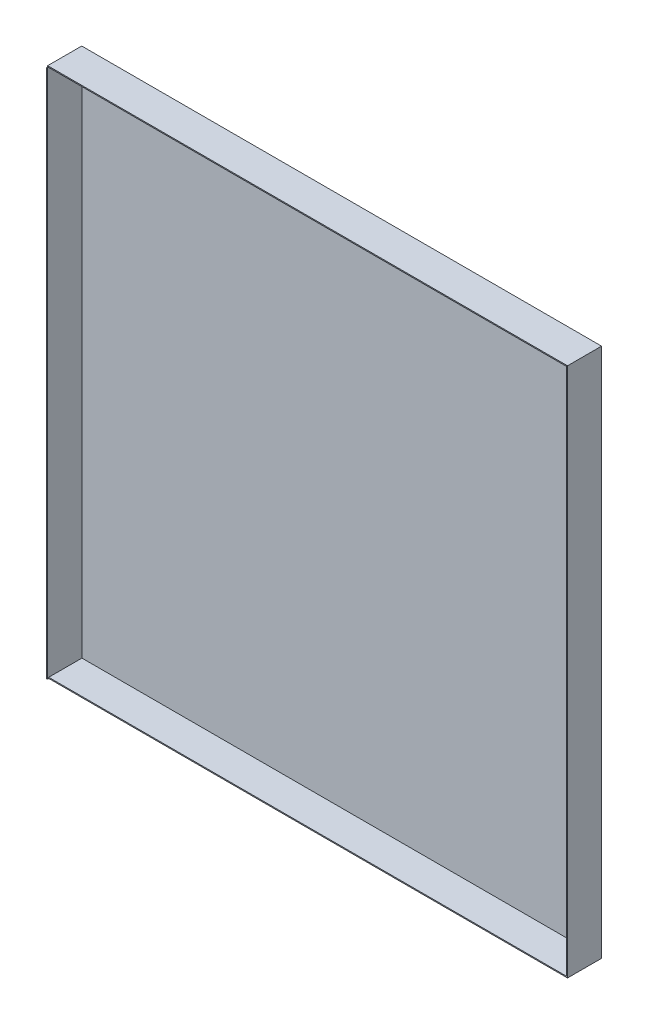
ISO-10303-21;
HEADER;
FILE_DESCRIPTION(('STEP AP214'),'2;1');
FILE_NAME('part.step','',(''),(''),'','','');
FILE_SCHEMA(('AUTOMOTIVE_DESIGN { 1 0 10303 214 1 1 1 1 }'));
ENDSEC;
DATA;
#1=APPLICATION_CONTEXT('core data for automotive mechanical design processes');
#2=APPLICATION_PROTOCOL_DEFINITION('international standard','automotive_design',2000,#1);
#3=PRODUCT_CONTEXT('',#1,'mechanical');
#4=PRODUCT('Part','Part','',(#3));
#5=PRODUCT_RELATED_PRODUCT_CATEGORY('part','',(#4));
#6=PRODUCT_DEFINITION_FORMATION('','',#4);
#7=PRODUCT_DEFINITION_CONTEXT('part definition',#1,'design');
#8=PRODUCT_DEFINITION('design','',#6,#7);
#9=PRODUCT_DEFINITION_SHAPE('','',#8);
#10=(LENGTH_UNIT() NAMED_UNIT(*) SI_UNIT(.MILLI.,.METRE.));
#11=(NAMED_UNIT(*) PLANE_ANGLE_UNIT() SI_UNIT($,.RADIAN.));
#12=(NAMED_UNIT(*) SI_UNIT($,.STERADIAN.) SOLID_ANGLE_UNIT());
#13=UNCERTAINTY_MEASURE_WITH_UNIT(LENGTH_MEASURE(1.E-05),#10,'distance_accuracy_value','');
#14=(GEOMETRIC_REPRESENTATION_CONTEXT(3) GLOBAL_UNCERTAINTY_ASSIGNED_CONTEXT((#13)) GLOBAL_UNIT_ASSIGNED_CONTEXT((#10,
#11,#12)) REPRESENTATION_CONTEXT('',''));
#15=CARTESIAN_POINT('',(0.,0.,0.));
#16=DIRECTION('',(0.,0.,1.));
#17=DIRECTION('',(1.,0.,0.));
#18=AXIS2_PLACEMENT_3D('',#15,#16,#17);
#19=CARTESIAN_POINT('',(0.,0.,0.8));
#20=DIRECTION('',(0.,0.,-1.));
#21=DIRECTION('',(-1.,0.,0.));
#22=AXIS2_PLACEMENT_3D('',#19,#20,#21);
#23=PLANE('',#22);
#24=DIRECTION('',(0.,-1.,0.));
#25=VECTOR('',#24,1.);
#26=CARTESIAN_POINT('',(1.,0.,0.8));
#27=LINE('',#26,#25);
#28=CARTESIAN_POINT('',(1.,509.996332586714,0.800000000000002));
#29=VERTEX_POINT('',#28);
#30=CARTESIAN_POINT('',(1.,1.,0.8));
#31=VERTEX_POINT('',#30);
#32=EDGE_CURVE('E165',#29,#31,#27,.T.);
#33=ORIENTED_EDGE('',*,*,#32,.T.);
#34=DIRECTION('',(1.,0.,0.));
#35=VECTOR('',#34,1.);
#36=CARTESIAN_POINT('',(0.,1.,0.8));
#37=LINE('',#36,#35);
#38=CARTESIAN_POINT('',(500.,1.,0.8));
#39=VERTEX_POINT('',#38);
#40=EDGE_CURVE('E59',#31,#39,#37,.T.);
#41=ORIENTED_EDGE('',*,*,#40,.T.);
#42=DIRECTION('',(0.,-1.,0.));
#43=VECTOR('',#42,1.);
#44=CARTESIAN_POINT('',(500.,0.,0.8));
#45=LINE('',#44,#43);
#46=CARTESIAN_POINT('',(500.,509.996332586714,0.8));
#47=VERTEX_POINT('',#46);
#48=EDGE_CURVE('E169',#47,#39,#45,.T.);
#49=ORIENTED_EDGE('',*,*,#48,.F.);
#50=DIRECTION('',(1.,0.,0.));
#51=VECTOR('',#50,1.);
#52=CARTESIAN_POINT('',(0.,509.996332586714,0.8));
#53=LINE('',#52,#51);
#54=EDGE_CURVE('E174',#29,#47,#53,.T.);
#55=ORIENTED_EDGE('',*,*,#54,.F.);
#56=EDGE_LOOP('',(#33,#41,#49,#55));
#57=FACE_BOUND('',#56,.T.);
#58=ADVANCED_FACE('F36',(#57),#23,.F.);
#59=CARTESIAN_POINT('',(0.,509.996332586714,32.8));
#60=DIRECTION('',(0.,1.,0.));
#61=DIRECTION('',(0.,0.,1.));
#62=AXIS2_PLACEMENT_3D('',#59,#60,#61);
#63=PLANE('',#62);
#64=DIRECTION('',(1.,0.,0.));
#65=VECTOR('',#64,1.);
#66=CARTESIAN_POINT('',(0.,509.996332586714,32.8));
#67=LINE('',#66,#65);
#68=CARTESIAN_POINT('',(1.,509.996332586714,32.8));
#69=VERTEX_POINT('',#68);
#70=CARTESIAN_POINT('',(500.,509.996332586714,32.8));
#71=VERTEX_POINT('',#70);
#72=EDGE_CURVE('E177',#69,#71,#67,.T.);
#73=ORIENTED_EDGE('',*,*,#72,.F.);
#74=DIRECTION('',(0.,0.,-1.));
#75=VECTOR('',#74,1.);
#76=CARTESIAN_POINT('',(1.,509.996332586714,34.));
#77=LINE('',#76,#75);
#78=EDGE_CURVE('E163',#69,#29,#77,.T.);
#79=ORIENTED_EDGE('',*,*,#78,.T.);
#80=ORIENTED_EDGE('',*,*,#54,.T.);
#81=DIRECTION('',(0.,0.,-1.));
#82=VECTOR('',#81,1.);
#83=CARTESIAN_POINT('',(500.,509.996332586714,32.8));
#84=LINE('',#83,#82);
#85=EDGE_CURVE('E129',#71,#47,#84,.T.);
#86=ORIENTED_EDGE('',*,*,#85,.F.);
#87=EDGE_LOOP('',(#73,#79,#80,#86));
#88=FACE_BOUND('',#87,.T.);
#89=ADVANCED_FACE('F222',(#88),#63,.F.);
#90=CARTESIAN_POINT('',(0.,0.,0.8));
#91=DIRECTION('',(1.,0.,0.));
#92=DIRECTION('',(0.,0.,-1.));
#93=AXIS2_PLACEMENT_3D('',#90,#91,#92);
#94=PLANE('',#93);
#95=DIRECTION('',(0.,0.,-1.));
#96=VECTOR('',#95,1.);
#97=CARTESIAN_POINT('',(0.,0.,0.8));
#98=LINE('',#97,#96);
#99=CARTESIAN_POINT('',(0.,0.,34.));
#100=VERTEX_POINT('',#99);
#101=CARTESIAN_POINT('',(0.,0.,0.));
#102=VERTEX_POINT('',#101);
#103=EDGE_CURVE('E11',#100,#102,#98,.T.);
#104=ORIENTED_EDGE('',*,*,#103,.F.);
#105=DIRECTION('',(0.,1.,0.));
#106=VECTOR('',#105,1.);
#107=CARTESIAN_POINT('',(0.,0.,34.));
#108=LINE('',#107,#106);
#109=CARTESIAN_POINT('',(0.,509.996332586714,34.));
#110=VERTEX_POINT('',#109);
#111=EDGE_CURVE('E160',#100,#110,#108,.T.);
#112=ORIENTED_EDGE('',*,*,#111,.T.);
#113=DIRECTION('',(0.,0.,-1.));
#114=VECTOR('',#113,1.);
#115=CARTESIAN_POINT('',(0.,509.996332586714,34.));
#116=LINE('',#115,#114);
#117=CARTESIAN_POINT('',(0.,509.996332586714,32.8));
#118=VERTEX_POINT('',#117);
#119=EDGE_CURVE('E139',#110,#118,#116,.T.);
#120=ORIENTED_EDGE('',*,*,#119,.T.);
#121=DIRECTION('',(0.,-1.,0.));
#122=VECTOR('',#121,1.);
#123=CARTESIAN_POINT('',(0.,0.,32.8));
#124=LINE('',#123,#122);
#125=CARTESIAN_POINT('',(0.,511.,32.8));
#126=VERTEX_POINT('',#125);
#127=EDGE_CURVE('E175',#126,#118,#124,.T.);
#128=ORIENTED_EDGE('',*,*,#127,.F.);
#129=DIRECTION('',(0.,0.,-1.));
#130=VECTOR('',#129,1.);
#131=CARTESIAN_POINT('',(0.,511.,0.8));
#132=LINE('',#131,#130);
#133=CARTESIAN_POINT('',(0.,511.,0.));
#134=VERTEX_POINT('',#133);
#135=EDGE_CURVE('E195',#126,#134,#132,.T.);
#136=ORIENTED_EDGE('',*,*,#135,.T.);
#137=DIRECTION('',(0.,-1.,0.));
#138=VECTOR('',#137,1.);
#139=CARTESIAN_POINT('',(0.,0.,0.));
#140=LINE('',#139,#138);
#141=EDGE_CURVE('E186',#134,#102,#140,.T.);
#142=ORIENTED_EDGE('',*,*,#141,.T.);
#143=EDGE_LOOP('',(#104,#112,#120,#128,#136,#142));
#144=FACE_BOUND('',#143,.T.);
#145=ADVANCED_FACE('F38',(#144),#94,.F.);
#146=CARTESIAN_POINT('',(0.,0.,0.8));
#147=DIRECTION('',(0.,1.,0.));
#148=DIRECTION('',(0.,0.,1.));
#149=AXIS2_PLACEMENT_3D('',#146,#147,#148);
#150=PLANE('',#149);
#151=DIRECTION('',(1.,0.,0.));
#152=VECTOR('',#151,1.);
#153=CARTESIAN_POINT('',(501.,0.,32.8));
#154=LINE('',#153,#152);
#155=CARTESIAN_POINT('',(1.,0.,32.8));
#156=VERTEX_POINT('',#155);
#157=CARTESIAN_POINT('',(501.,0.,32.8));
#158=VERTEX_POINT('',#157);
#159=EDGE_CURVE('E118',#156,#158,#154,.T.);
#160=ORIENTED_EDGE('',*,*,#159,.F.);
#161=DIRECTION('',(0.,0.,-1.));
#162=VECTOR('',#161,1.);
#163=CARTESIAN_POINT('',(1.,0.,34.));
#164=LINE('',#163,#162);
#165=CARTESIAN_POINT('',(1.,0.,34.));
#166=VERTEX_POINT('',#165);
#167=EDGE_CURVE('E122',#166,#156,#164,.T.);
#168=ORIENTED_EDGE('',*,*,#167,.F.);
#169=DIRECTION('',(-1.,0.,0.));
#170=VECTOR('',#169,1.);
#171=CARTESIAN_POINT('',(0.,0.,34.));
#172=LINE('',#171,#170);
#173=EDGE_CURVE('E158',#166,#100,#172,.T.);
#174=ORIENTED_EDGE('',*,*,#173,.T.);
#175=ORIENTED_EDGE('',*,*,#103,.T.);
#176=DIRECTION('',(1.,0.,0.));
#177=VECTOR('',#176,1.);
#178=CARTESIAN_POINT('',(0.,0.,0.));
#179=LINE('',#178,#177);
#180=CARTESIAN_POINT('',(501.,0.,0.));
#181=VERTEX_POINT('',#180);
#182=EDGE_CURVE('E189',#102,#181,#179,.T.);
#183=ORIENTED_EDGE('',*,*,#182,.T.);
#184=DIRECTION('',(0.,0.,-1.));
#185=VECTOR('',#184,1.);
#186=CARTESIAN_POINT('',(501.,0.,0.8));
#187=LINE('',#186,#185);
#188=EDGE_CURVE('E44',#158,#181,#187,.T.);
#189=ORIENTED_EDGE('',*,*,#188,.F.);
#190=EDGE_LOOP('',(#160,#168,#174,#175,#183,#189));
#191=FACE_BOUND('',#190,.T.);
#192=ADVANCED_FACE('F120',(#191),#150,.F.);
#193=CARTESIAN_POINT('',(501.,0.,0.8));
#194=DIRECTION('',(-1.,0.,0.));
#195=DIRECTION('',(0.,0.,1.));
#196=AXIS2_PLACEMENT_3D('',#193,#194,#195);
#197=PLANE('',#196);
#198=DIRECTION('',(0.,1.,0.));
#199=VECTOR('',#198,1.);
#200=CARTESIAN_POINT('',(501.,0.,0.));
#201=LINE('',#200,#199);
#202=CARTESIAN_POINT('',(501.,511.,0.));
#203=VERTEX_POINT('',#202);
#204=EDGE_CURVE('E191',#181,#203,#201,.T.);
#205=ORIENTED_EDGE('',*,*,#204,.T.);
#206=DIRECTION('',(0.,0.,-1.));
#207=VECTOR('',#206,1.);
#208=CARTESIAN_POINT('',(501.,511.,0.8));
#209=LINE('',#208,#207);
#210=CARTESIAN_POINT('',(501.,511.,32.8));
#211=VERTEX_POINT('',#210);
#212=EDGE_CURVE('E198',#211,#203,#209,.T.);
#213=ORIENTED_EDGE('',*,*,#212,.F.);
#214=DIRECTION('',(0.,1.,0.));
#215=VECTOR('',#214,1.);
#216=CARTESIAN_POINT('',(501.,0.,32.8));
#217=LINE('',#216,#215);
#218=EDGE_CURVE('E181',#158,#211,#217,.T.);
#219=ORIENTED_EDGE('',*,*,#218,.F.);
#220=ORIENTED_EDGE('',*,*,#188,.T.);
#221=EDGE_LOOP('',(#205,#213,#219,#220));
#222=FACE_BOUND('',#221,.T.);
#223=ADVANCED_FACE('F202',(#222),#197,.F.);
#224=CARTESIAN_POINT('',(0.,511.,0.8));
#225=DIRECTION('',(0.,-1.,0.));
#226=DIRECTION('',(0.,0.,-1.));
#227=AXIS2_PLACEMENT_3D('',#224,#225,#226);
#228=PLANE('',#227);
#229=DIRECTION('',(-1.,0.,0.));
#230=VECTOR('',#229,1.);
#231=CARTESIAN_POINT('',(0.,511.,0.));
#232=LINE('',#231,#230);
#233=EDGE_CURVE('E193',#203,#134,#232,.T.);
#234=ORIENTED_EDGE('',*,*,#233,.T.);
#235=ORIENTED_EDGE('',*,*,#135,.F.);
#236=DIRECTION('',(-1.,0.,0.));
#237=VECTOR('',#236,1.);
#238=CARTESIAN_POINT('',(0.,511.,32.8));
#239=LINE('',#238,#237);
#240=EDGE_CURVE('E183',#211,#126,#239,.T.);
#241=ORIENTED_EDGE('',*,*,#240,.F.);
#242=ORIENTED_EDGE('',*,*,#212,.T.);
#243=EDGE_LOOP('',(#234,#235,#241,#242));
#244=FACE_BOUND('',#243,.T.);
#245=ADVANCED_FACE('F209',(#244),#228,.F.);
#246=CARTESIAN_POINT('',(0.,0.,0.));
#247=DIRECTION('',(0.,0.,-1.));
#248=DIRECTION('',(-1.,0.,0.));
#249=AXIS2_PLACEMENT_3D('',#246,#247,#248);
#250=PLANE('',#249);
#251=ORIENTED_EDGE('',*,*,#182,.F.);
#252=ORIENTED_EDGE('',*,*,#141,.F.);
#253=ORIENTED_EDGE('',*,*,#233,.F.);
#254=ORIENTED_EDGE('',*,*,#204,.F.);
#255=EDGE_LOOP('',(#251,#252,#253,#254));
#256=FACE_BOUND('',#255,.T.);
#257=ADVANCED_FACE('F206',(#256),#250,.T.);
#258=CARTESIAN_POINT('',(0.,0.,32.8));
#259=DIRECTION('',(0.,0.,1.));
#260=DIRECTION('',(1.,0.,0.));
#261=AXIS2_PLACEMENT_3D('',#258,#259,#260);
#262=PLANE('',#261);
#263=ORIENTED_EDGE('',*,*,#127,.T.);
#264=EDGE_CURVE('E178',#118,#69,#67,.T.);
#265=ORIENTED_EDGE('',*,*,#264,.T.);
#266=ORIENTED_EDGE('',*,*,#72,.T.);
#267=DIRECTION('',(0.,-1.,0.));
#268=VECTOR('',#267,1.);
#269=CARTESIAN_POINT('',(500.,0.,32.8));
#270=LINE('',#269,#268);
#271=CARTESIAN_POINT('',(500.,1.,32.8));
#272=VERTEX_POINT('',#271);
#273=EDGE_CURVE('E130',#71,#272,#270,.T.);
#274=ORIENTED_EDGE('',*,*,#273,.T.);
#275=DIRECTION('',(1.,0.,0.));
#276=VECTOR('',#275,1.);
#277=CARTESIAN_POINT('',(0.,1.,32.8));
#278=LINE('',#277,#276);
#279=CARTESIAN_POINT('',(1.,1.,32.8));
#280=VERTEX_POINT('',#279);
#281=EDGE_CURVE('E146',#280,#272,#278,.T.);
#282=ORIENTED_EDGE('',*,*,#281,.F.);
#283=DIRECTION('',(0.,-1.,0.));
#284=VECTOR('',#283,1.);
#285=CARTESIAN_POINT('',(1.,0.,32.8));
#286=LINE('',#285,#284);
#287=EDGE_CURVE('E135',#280,#156,#286,.T.);
#288=ORIENTED_EDGE('',*,*,#287,.T.);
#289=ORIENTED_EDGE('',*,*,#159,.T.);
#290=ORIENTED_EDGE('',*,*,#218,.T.);
#291=ORIENTED_EDGE('',*,*,#240,.T.);
#292=EDGE_LOOP('',(#263,#265,#266,#274,#282,#288,#289,#290,#291));
#293=FACE_BOUND('',#292,.T.);
#294=ADVANCED_FACE('F144',(#293),#262,.T.);
#295=CARTESIAN_POINT('',(500.,0.,32.8));
#296=DIRECTION('',(1.,0.,0.));
#297=DIRECTION('',(0.,0.,-1.));
#298=AXIS2_PLACEMENT_3D('',#295,#296,#297);
#299=PLANE('',#298);
#300=ORIENTED_EDGE('',*,*,#48,.T.);
#301=DIRECTION('',(0.,0.,-1.));
#302=VECTOR('',#301,1.);
#303=CARTESIAN_POINT('',(500.,1.,32.8));
#304=LINE('',#303,#302);
#305=EDGE_CURVE('E51',#272,#39,#304,.T.);
#306=ORIENTED_EDGE('',*,*,#305,.F.);
#307=ORIENTED_EDGE('',*,*,#273,.F.);
#308=ORIENTED_EDGE('',*,*,#85,.T.);
#309=EDGE_LOOP('',(#300,#306,#307,#308));
#310=FACE_BOUND('',#309,.T.);
#311=ADVANCED_FACE('F223',(#310),#299,.F.);
#312=CARTESIAN_POINT('',(1.,0.,34.));
#313=DIRECTION('',(1.,0.,0.));
#314=DIRECTION('',(0.,0.,-1.));
#315=AXIS2_PLACEMENT_3D('',#312,#313,#314);
#316=PLANE('',#315);
#317=DIRECTION('',(0.,0.,-1.));
#318=VECTOR('',#317,1.);
#319=CARTESIAN_POINT('',(1.,1.,32.8));
#320=LINE('',#319,#318);
#321=EDGE_CURVE('E148',#280,#31,#320,.T.);
#322=ORIENTED_EDGE('',*,*,#321,.T.);
#323=ORIENTED_EDGE('',*,*,#32,.F.);
#324=ORIENTED_EDGE('',*,*,#78,.F.);
#325=CARTESIAN_POINT('',(1.,509.996332586714,34.));
#326=VERTEX_POINT('',#325);
#327=EDGE_CURVE('E140',#326,#69,#77,.T.);
#328=ORIENTED_EDGE('',*,*,#327,.F.);
#329=DIRECTION('',(0.,-1.,0.));
#330=VECTOR('',#329,1.);
#331=CARTESIAN_POINT('',(1.,0.,34.));
#332=LINE('',#331,#330);
#333=EDGE_CURVE('E138',#326,#166,#332,.T.);
#334=ORIENTED_EDGE('',*,*,#333,.T.);
#335=ORIENTED_EDGE('',*,*,#167,.T.);
#336=ORIENTED_EDGE('',*,*,#287,.F.);
#337=EDGE_LOOP('',(#322,#323,#324,#328,#334,#335,#336));
#338=FACE_BOUND('',#337,.T.);
#339=ADVANCED_FACE('F134',(#338),#316,.T.);
#340=CARTESIAN_POINT('',(0.,509.996332586714,34.));
#341=DIRECTION('',(0.,1.,0.));
#342=DIRECTION('',(0.,0.,1.));
#343=AXIS2_PLACEMENT_3D('',#340,#341,#342);
#344=PLANE('',#343);
#345=ORIENTED_EDGE('',*,*,#327,.T.);
#346=ORIENTED_EDGE('',*,*,#264,.F.);
#347=ORIENTED_EDGE('',*,*,#119,.F.);
#348=DIRECTION('',(1.,0.,0.));
#349=VECTOR('',#348,1.);
#350=CARTESIAN_POINT('',(0.,509.996332586714,34.));
#351=LINE('',#350,#349);
#352=EDGE_CURVE('E154',#110,#326,#351,.T.);
#353=ORIENTED_EDGE('',*,*,#352,.T.);
#354=EDGE_LOOP('',(#345,#346,#347,#353));
#355=FACE_BOUND('',#354,.T.);
#356=ADVANCED_FACE('F215',(#355),#344,.T.);
#357=CARTESIAN_POINT('',(0.,0.,34.));
#358=DIRECTION('',(0.,0.,-1.));
#359=DIRECTION('',(-1.,0.,0.));
#360=AXIS2_PLACEMENT_3D('',#357,#358,#359);
#361=PLANE('',#360);
#362=ORIENTED_EDGE('',*,*,#352,.F.);
#363=ORIENTED_EDGE('',*,*,#111,.F.);
#364=ORIENTED_EDGE('',*,*,#173,.F.);
#365=ORIENTED_EDGE('',*,*,#333,.F.);
#366=EDGE_LOOP('',(#362,#363,#364,#365));
#367=FACE_BOUND('',#366,.T.);
#368=ADVANCED_FACE('F227',(#367),#361,.F.);
#369=CARTESIAN_POINT('',(0.,1.,32.8));
#370=DIRECTION('',(0.,1.,0.));
#371=DIRECTION('',(-1.,0.,0.));
#372=AXIS2_PLACEMENT_3D('',#369,#370,#371);
#373=PLANE('',#372);
#374=ORIENTED_EDGE('',*,*,#40,.F.);
#375=ORIENTED_EDGE('',*,*,#321,.F.);
#376=ORIENTED_EDGE('',*,*,#281,.T.);
#377=ORIENTED_EDGE('',*,*,#305,.T.);
#378=EDGE_LOOP('',(#374,#375,#376,#377));
#379=FACE_BOUND('',#378,.T.);
#380=ADVANCED_FACE('F225',(#379),#373,.T.);
#381=CLOSED_SHELL('',(#58,#89,#145,#192,#223,#245,#257,#294,#311,#339,#356,#368,#380));
#382=MANIFOLD_SOLID_BREP('B2',#381);
#383=ADVANCED_BREP_SHAPE_REPRESENTATION('',(#18,#382),#14);
#384=SHAPE_DEFINITION_REPRESENTATION(#9,#383);
ENDSEC;
END-ISO-10303-21;
